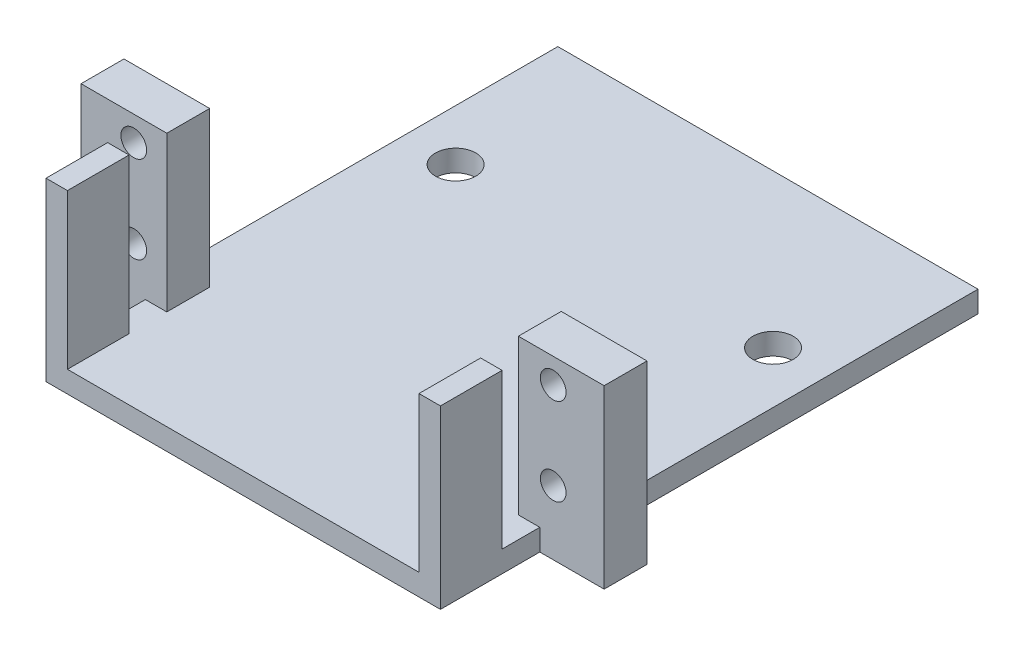
ISO-10303-21;
HEADER;
FILE_DESCRIPTION(('STEP AP214'),'2;1');
FILE_NAME('part.step','',(''),(''),'','','');
FILE_SCHEMA(('AUTOMOTIVE_DESIGN { 1 0 10303 214 1 1 1 1 }'));
ENDSEC;
DATA;
#1=APPLICATION_CONTEXT('core data for automotive mechanical design processes');
#2=APPLICATION_PROTOCOL_DEFINITION('international standard','automotive_design',2000,#1);
#3=PRODUCT_CONTEXT('',#1,'mechanical');
#4=PRODUCT('Part','Part','',(#3));
#5=PRODUCT_RELATED_PRODUCT_CATEGORY('part','',(#4));
#6=PRODUCT_DEFINITION_FORMATION('','',#4);
#7=PRODUCT_DEFINITION_CONTEXT('part definition',#1,'design');
#8=PRODUCT_DEFINITION('design','',#6,#7);
#9=PRODUCT_DEFINITION_SHAPE('','',#8);
#10=(LENGTH_UNIT() NAMED_UNIT(*) SI_UNIT(.MILLI.,.METRE.));
#11=(NAMED_UNIT(*) PLANE_ANGLE_UNIT() SI_UNIT($,.RADIAN.));
#12=(NAMED_UNIT(*) SI_UNIT($,.STERADIAN.) SOLID_ANGLE_UNIT());
#13=UNCERTAINTY_MEASURE_WITH_UNIT(LENGTH_MEASURE(1.E-05),#10,'distance_accuracy_value','');
#14=(GEOMETRIC_REPRESENTATION_CONTEXT(3) GLOBAL_UNCERTAINTY_ASSIGNED_CONTEXT((#13)) GLOBAL_UNIT_ASSIGNED_CONTEXT((#10,
#11,#12)) REPRESENTATION_CONTEXT('',''));
#15=CARTESIAN_POINT('',(0.,0.,0.));
#16=DIRECTION('',(0.,0.,1.));
#17=DIRECTION('',(1.,0.,0.));
#18=AXIS2_PLACEMENT_3D('',#15,#16,#17);
#19=CARTESIAN_POINT('',(0.,0.,-16.5879556901824));
#20=DIRECTION('',(0.,0.,-1.));
#21=DIRECTION('',(-1.,0.,0.));
#22=AXIS2_PLACEMENT_3D('',#19,#20,#21);
#23=PLANE('',#22);
#24=CARTESIAN_POINT('',(47.5606848099596,17.6577374882275,-16.5879556901824));
#25=DIRECTION('',(0.,0.,-1.));
#26=DIRECTION('',(-1.,0.,0.));
#27=AXIS2_PLACEMENT_3D('',#24,#25,#26);
#28=CIRCLE('',#27,1.5);
#29=CARTESIAN_POINT('',(46.0606848099596,17.6577374882275,-16.5879556901824));
#30=VERTEX_POINT('',#29);
#31=EDGE_CURVE('E203',#30,#30,#28,.T.);
#32=ORIENTED_EDGE('',*,*,#31,.F.);
#33=EDGE_LOOP('',(#32));
#34=FACE_BOUND('',#33,.T.);
#35=CARTESIAN_POINT('',(47.5606848099596,7.49231825723698,-16.5879556901824));
#36=DIRECTION('',(0.,0.,-1.));
#37=DIRECTION('',(-1.,0.,0.));
#38=AXIS2_PLACEMENT_3D('',#35,#36,#37);
#39=CIRCLE('',#38,1.5);
#40=CARTESIAN_POINT('',(46.0606848099596,7.49231825723698,-16.5879556901824));
#41=VERTEX_POINT('',#40);
#42=EDGE_CURVE('E238',#41,#41,#39,.T.);
#43=ORIENTED_EDGE('',*,*,#42,.F.);
#44=EDGE_LOOP('',(#43));
#45=FACE_BOUND('',#44,.T.);
#46=DIRECTION('',(0.,-1.,0.));
#47=VECTOR('',#46,1.);
#48=CARTESIAN_POINT('',(43.5,23.3351197596058,-16.5879556901824));
#49=LINE('',#48,#47);
#50=CARTESIAN_POINT('',(43.5,20.5528543990891,-16.5879556901824));
#51=VERTEX_POINT('',#50);
#52=CARTESIAN_POINT('',(43.5,2.5,-16.5879556901824));
#53=VERTEX_POINT('',#52);
#54=EDGE_CURVE('E299',#51,#53,#49,.T.);
#55=ORIENTED_EDGE('',*,*,#54,.F.);
#56=DIRECTION('',(-1.,0.,0.));
#57=VECTOR('',#56,1.);
#58=CARTESIAN_POINT('',(43.5,20.5528543990891,-16.5879556901824));
#59=LINE('',#58,#57);
#60=CARTESIAN_POINT('',(53.5,20.5528543990891,-16.5879556901824));
#61=VERTEX_POINT('',#60);
#62=EDGE_CURVE('E308',#61,#51,#59,.T.);
#63=ORIENTED_EDGE('',*,*,#62,.F.);
#64=DIRECTION('',(0.,1.,0.));
#65=VECTOR('',#64,1.);
#66=CARTESIAN_POINT('',(53.5,20.5528543990891,-16.5879556901824));
#67=LINE('',#66,#65);
#68=CARTESIAN_POINT('',(53.5,0.,-16.5879556901824));
#69=VERTEX_POINT('',#68);
#70=EDGE_CURVE('E313',#69,#61,#67,.T.);
#71=ORIENTED_EDGE('',*,*,#70,.F.);
#72=DIRECTION('',(1.,0.,0.));
#73=VECTOR('',#72,1.);
#74=CARTESIAN_POINT('',(2.5,0.,-16.5879556901824));
#75=LINE('',#74,#73);
#76=CARTESIAN_POINT('',(47.5,0.,-16.5879556901824));
#77=VERTEX_POINT('',#76);
#78=EDGE_CURVE('E331',#77,#69,#75,.T.);
#79=ORIENTED_EDGE('',*,*,#78,.F.);
#80=DIRECTION('',(0.,-1.,0.));
#81=VECTOR('',#80,1.);
#82=CARTESIAN_POINT('',(47.5,2.5,-16.5879556901824));
#83=LINE('',#82,#81);
#84=CARTESIAN_POINT('',(47.5,2.5,-16.5879556901824));
#85=VERTEX_POINT('',#84);
#86=EDGE_CURVE('E231',#85,#77,#83,.T.);
#87=ORIENTED_EDGE('',*,*,#86,.F.);
#88=DIRECTION('',(1.,0.,0.));
#89=VECTOR('',#88,1.);
#90=CARTESIAN_POINT('',(47.5,2.5,-16.5879556901824));
#91=LINE('',#90,#89);
#92=EDGE_CURVE('E11',#53,#85,#91,.T.);
#93=ORIENTED_EDGE('',*,*,#92,.F.);
#94=EDGE_LOOP('',(#55,#63,#71,#79,#87,#93));
#95=FACE_BOUND('',#94,.T.);
#96=ADVANCED_FACE('F45',(#34,#45,#95),#23,.T.);
#97=CARTESIAN_POINT('',(0.,2.5,0.));
#98=DIRECTION('',(1.,0.,0.));
#99=DIRECTION('',(0.,0.,-1.));
#100=AXIS2_PLACEMENT_3D('',#97,#98,#99);
#101=PLANE('',#100);
#102=DIRECTION('',(0.,-1.,0.));
#103=VECTOR('',#102,1.);
#104=CARTESIAN_POINT('',(0.,2.5,0.));
#105=LINE('',#104,#103);
#106=CARTESIAN_POINT('',(0.,20.5528543990891,0.));
#107=VERTEX_POINT('',#106);
#108=CARTESIAN_POINT('',(0.,0.,0.));
#109=VERTEX_POINT('',#108);
#110=EDGE_CURVE('E54',#107,#109,#105,.T.);
#111=ORIENTED_EDGE('',*,*,#110,.F.);
#112=DIRECTION('',(0.,0.,1.));
#113=VECTOR('',#112,1.);
#114=CARTESIAN_POINT('',(0.,20.5528543990891,0.));
#115=LINE('',#114,#113);
#116=CARTESIAN_POINT('',(0.,20.5528543990891,-7.18795569018244));
#117=VERTEX_POINT('',#116);
#118=EDGE_CURVE('E195',#117,#107,#115,.T.);
#119=ORIENTED_EDGE('',*,*,#118,.F.);
#120=DIRECTION('',(0.,-1.,0.));
#121=VECTOR('',#120,1.);
#122=CARTESIAN_POINT('',(0.,23.3351197596058,-7.18795569018244));
#123=LINE('',#122,#121);
#124=CARTESIAN_POINT('',(0.,2.5,-7.18795569018244));
#125=VERTEX_POINT('',#124);
#126=EDGE_CURVE('E369',#117,#125,#123,.T.);
#127=ORIENTED_EDGE('',*,*,#126,.T.);
#128=DIRECTION('',(0.,0.,1.));
#129=VECTOR('',#128,1.);
#130=CARTESIAN_POINT('',(0.,2.5,0.));
#131=LINE('',#130,#129);
#132=CARTESIAN_POINT('',(0.,2.5,-11.5879556901824));
#133=VERTEX_POINT('',#132);
#134=EDGE_CURVE('E385',#133,#125,#131,.T.);
#135=ORIENTED_EDGE('',*,*,#134,.F.);
#136=DIRECTION('',(0.,1.,0.));
#137=VECTOR('',#136,1.);
#138=CARTESIAN_POINT('',(0.,2.5,-11.5879556901824));
#139=LINE('',#138,#137);
#140=CARTESIAN_POINT('',(0.,0.,-11.5879556901824));
#141=VERTEX_POINT('',#140);
#142=EDGE_CURVE('E343',#141,#133,#139,.T.);
#143=ORIENTED_EDGE('',*,*,#142,.F.);
#144=DIRECTION('',(0.,0.,1.));
#145=VECTOR('',#144,1.);
#146=CARTESIAN_POINT('',(0.,0.,0.));
#147=LINE('',#146,#145);
#148=EDGE_CURVE('E217',#141,#109,#147,.T.);
#149=ORIENTED_EDGE('',*,*,#148,.T.);
#150=EDGE_LOOP('',(#111,#119,#127,#135,#143,#149));
#151=FACE_BOUND('',#150,.T.);
#152=ADVANCED_FACE('F47',(#151),#101,.F.);
#153=CARTESIAN_POINT('',(0.,2.5,0.));
#154=DIRECTION('',(0.,-1.,0.));
#155=DIRECTION('',(0.,0.,-1.));
#156=AXIS2_PLACEMENT_3D('',#153,#154,#155);
#157=PLANE('',#156);
#158=CARTESIAN_POINT('',(4.45821471843474,2.5,-43.3137770735381));
#159=DIRECTION('',(0.,1.,0.));
#160=DIRECTION('',(0.,0.,1.));
#161=AXIS2_PLACEMENT_3D('',#158,#159,#160);
#162=CIRCLE('',#161,2.35);
#163=CARTESIAN_POINT('',(4.45821471843474,2.5,-40.9637770735381));
#164=VERTEX_POINT('',#163);
#165=EDGE_CURVE('E229',#164,#164,#162,.T.);
#166=ORIENTED_EDGE('',*,*,#165,.F.);
#167=EDGE_LOOP('',(#166));
#168=FACE_BOUND('',#167,.T.);
#169=CARTESIAN_POINT('',(41.4727830719634,2.5,-43.3137770735381));
#170=DIRECTION('',(0.,1.,0.));
#171=DIRECTION('',(0.,0.,1.));
#172=AXIS2_PLACEMENT_3D('',#169,#170,#171);
#173=CIRCLE('',#172,2.35);
#174=CARTESIAN_POINT('',(41.4727830719634,2.5,-40.9637770735381));
#175=VERTEX_POINT('',#174);
#176=EDGE_CURVE('E267',#175,#175,#173,.T.);
#177=ORIENTED_EDGE('',*,*,#176,.F.);
#178=EDGE_LOOP('',(#177));
#179=FACE_BOUND('',#178,.T.);
#180=DIRECTION('',(0.,0.,1.));
#181=VECTOR('',#180,1.);
#182=CARTESIAN_POINT('',(43.5,2.5,-36.6140310455788));
#183=LINE('',#182,#181);
#184=CARTESIAN_POINT('',(43.5,2.5,-11.5879556901824));
#185=VERTEX_POINT('',#184);
#186=EDGE_CURVE('E351',#53,#185,#183,.T.);
#187=ORIENTED_EDGE('',*,*,#186,.F.);
#188=ORIENTED_EDGE('',*,*,#92,.T.);
#189=DIRECTION('',(0.,0.,1.));
#190=VECTOR('',#189,1.);
#191=CARTESIAN_POINT('',(47.5,2.5,-61.1897123757275));
#192=LINE('',#191,#190);
#193=CARTESIAN_POINT('',(47.5,2.5,-61.1897123757275));
#194=VERTEX_POINT('',#193);
#195=EDGE_CURVE('E281',#194,#85,#192,.T.);
#196=ORIENTED_EDGE('',*,*,#195,.F.);
#197=DIRECTION('',(1.,0.,0.));
#198=VECTOR('',#197,1.);
#199=CARTESIAN_POINT('',(47.5,2.5,-61.1897123757275));
#200=LINE('',#199,#198);
#201=CARTESIAN_POINT('',(-1.5,2.5,-61.1897123757275));
#202=VERTEX_POINT('',#201);
#203=EDGE_CURVE('E279',#202,#194,#200,.T.);
#204=ORIENTED_EDGE('',*,*,#203,.F.);
#205=DIRECTION('',(0.,0.,1.));
#206=VECTOR('',#205,1.);
#207=CARTESIAN_POINT('',(-1.5,2.5,-61.1897123757275));
#208=LINE('',#207,#206);
#209=CARTESIAN_POINT('',(-1.5,2.5,-16.5879556901824));
#210=VERTEX_POINT('',#209);
#211=EDGE_CURVE('E290',#202,#210,#208,.T.);
#212=ORIENTED_EDGE('',*,*,#211,.T.);
#213=CARTESIAN_POINT('',(2.5,2.5,-16.5879556901824));
#214=VERTEX_POINT('',#213);
#215=EDGE_CURVE('E56',#210,#214,#91,.T.);
#216=ORIENTED_EDGE('',*,*,#215,.T.);
#217=DIRECTION('',(0.,0.,-1.));
#218=VECTOR('',#217,1.);
#219=CARTESIAN_POINT('',(2.5,2.5,-36.6140310455788));
#220=LINE('',#219,#218);
#221=CARTESIAN_POINT('',(2.5,2.5,-11.5879556901824));
#222=VERTEX_POINT('',#221);
#223=EDGE_CURVE('E380',#222,#214,#220,.T.);
#224=ORIENTED_EDGE('',*,*,#223,.F.);
#225=DIRECTION('',(1.,0.,0.));
#226=VECTOR('',#225,1.);
#227=CARTESIAN_POINT('',(0.,2.5,-11.5879556901824));
#228=LINE('',#227,#226);
#229=EDGE_CURVE('E377',#133,#222,#228,.T.);
#230=ORIENTED_EDGE('',*,*,#229,.F.);
#231=ORIENTED_EDGE('',*,*,#134,.T.);
#232=DIRECTION('',(-1.,0.,0.));
#233=VECTOR('',#232,1.);
#234=CARTESIAN_POINT('',(0.,2.5,-7.18795569018244));
#235=LINE('',#234,#233);
#236=CARTESIAN_POINT('',(2.5,2.5,-7.18795569018244));
#237=VERTEX_POINT('',#236);
#238=EDGE_CURVE('E371',#237,#125,#235,.T.);
#239=ORIENTED_EDGE('',*,*,#238,.F.);
#240=DIRECTION('',(0.,0.,-1.));
#241=VECTOR('',#240,1.);
#242=CARTESIAN_POINT('',(2.5,2.5,0.));
#243=LINE('',#242,#241);
#244=CARTESIAN_POINT('',(2.5,2.5,0.));
#245=VERTEX_POINT('',#244);
#246=EDGE_CURVE('E374',#245,#237,#243,.T.);
#247=ORIENTED_EDGE('',*,*,#246,.F.);
#248=DIRECTION('',(1.,0.,0.));
#249=VECTOR('',#248,1.);
#250=CARTESIAN_POINT('',(0.,2.5,0.));
#251=LINE('',#250,#249);
#252=CARTESIAN_POINT('',(43.5,2.5,0.));
#253=VERTEX_POINT('',#252);
#254=EDGE_CURVE('E388',#245,#253,#251,.T.);
#255=ORIENTED_EDGE('',*,*,#254,.T.);
#256=DIRECTION('',(0.,0.,1.));
#257=VECTOR('',#256,1.);
#258=CARTESIAN_POINT('',(43.5,2.5,0.));
#259=LINE('',#258,#257);
#260=CARTESIAN_POINT('',(43.5,2.5,-7.18795569018244));
#261=VERTEX_POINT('',#260);
#262=EDGE_CURVE('E360',#261,#253,#259,.T.);
#263=ORIENTED_EDGE('',*,*,#262,.F.);
#264=DIRECTION('',(-1.,0.,0.));
#265=VECTOR('',#264,1.);
#266=CARTESIAN_POINT('',(46.,2.5,-7.18795569018244));
#267=LINE('',#266,#265);
#268=CARTESIAN_POINT('',(46.,2.5,-7.18795569018244));
#269=VERTEX_POINT('',#268);
#270=EDGE_CURVE('E363',#269,#261,#267,.T.);
#271=ORIENTED_EDGE('',*,*,#270,.F.);
#272=DIRECTION('',(0.,0.,-1.));
#273=VECTOR('',#272,1.);
#274=CARTESIAN_POINT('',(46.,2.5,0.));
#275=LINE('',#274,#273);
#276=CARTESIAN_POINT('',(46.,2.5,-11.5879556901824));
#277=VERTEX_POINT('',#276);
#278=EDGE_CURVE('E221',#269,#277,#275,.T.);
#279=ORIENTED_EDGE('',*,*,#278,.T.);
#280=DIRECTION('',(1.,0.,0.));
#281=VECTOR('',#280,1.);
#282=CARTESIAN_POINT('',(46.,2.5,-11.5879556901824));
#283=LINE('',#282,#281);
#284=EDGE_CURVE('E349',#185,#277,#283,.T.);
#285=ORIENTED_EDGE('',*,*,#284,.F.);
#286=EDGE_LOOP('',(#187,#188,#196,#204,#212,#216,#224,#230,#231,#239,#247,#255,#263,#271,#279,#285));
#287=FACE_BOUND('',#286,.T.);
#288=ADVANCED_FACE('F425',(#168,#179,#287),#157,.F.);
#289=CARTESIAN_POINT('',(0.,2.5,0.));
#290=DIRECTION('',(0.,0.,-1.));
#291=DIRECTION('',(-1.,0.,0.));
#292=AXIS2_PLACEMENT_3D('',#289,#290,#291);
#293=PLANE('',#292);
#294=DIRECTION('',(0.,-1.,0.));
#295=VECTOR('',#294,1.);
#296=CARTESIAN_POINT('',(46.,2.5,0.));
#297=LINE('',#296,#295);
#298=CARTESIAN_POINT('',(46.,20.5528543990891,0.));
#299=VERTEX_POINT('',#298);
#300=CARTESIAN_POINT('',(46.,0.,0.));
#301=VERTEX_POINT('',#300);
#302=EDGE_CURVE('E219',#299,#301,#297,.T.);
#303=ORIENTED_EDGE('',*,*,#302,.F.);
#304=DIRECTION('',(-1.,0.,0.));
#305=VECTOR('',#304,1.);
#306=CARTESIAN_POINT('',(47.,20.5528543990891,0.));
#307=LINE('',#306,#305);
#308=CARTESIAN_POINT('',(43.5,20.5528543990891,0.));
#309=VERTEX_POINT('',#308);
#310=EDGE_CURVE('E213',#299,#309,#307,.T.);
#311=ORIENTED_EDGE('',*,*,#310,.T.);
#312=DIRECTION('',(0.,-1.,0.));
#313=VECTOR('',#312,1.);
#314=CARTESIAN_POINT('',(43.5,23.3351197596058,0.));
#315=LINE('',#314,#313);
#316=EDGE_CURVE('E358',#309,#253,#315,.T.);
#317=ORIENTED_EDGE('',*,*,#316,.T.);
#318=ORIENTED_EDGE('',*,*,#254,.F.);
#319=DIRECTION('',(0.,-1.,0.));
#320=VECTOR('',#319,1.);
#321=CARTESIAN_POINT('',(2.5,23.3351197596058,0.));
#322=LINE('',#321,#320);
#323=CARTESIAN_POINT('',(2.5,20.5528543990891,0.));
#324=VERTEX_POINT('',#323);
#325=EDGE_CURVE('E212',#324,#245,#322,.T.);
#326=ORIENTED_EDGE('',*,*,#325,.F.);
#327=EDGE_CURVE('E198',#324,#107,#307,.T.);
#328=ORIENTED_EDGE('',*,*,#327,.T.);
#329=ORIENTED_EDGE('',*,*,#110,.T.);
#330=DIRECTION('',(1.,0.,0.));
#331=VECTOR('',#330,1.);
#332=CARTESIAN_POINT('',(0.,0.,0.));
#333=LINE('',#332,#331);
#334=EDGE_CURVE('E395',#109,#301,#333,.T.);
#335=ORIENTED_EDGE('',*,*,#334,.T.);
#336=EDGE_LOOP('',(#303,#311,#317,#318,#326,#328,#329,#335));
#337=FACE_BOUND('',#336,.T.);
#338=ADVANCED_FACE('F208',(#337),#293,.F.);
#339=CARTESIAN_POINT('',(46.,2.5,0.));
#340=DIRECTION('',(-1.,0.,0.));
#341=DIRECTION('',(0.,0.,1.));
#342=AXIS2_PLACEMENT_3D('',#339,#340,#341);
#343=PLANE('',#342);
#344=DIRECTION('',(0.,-1.,0.));
#345=VECTOR('',#344,1.);
#346=CARTESIAN_POINT('',(46.,23.3351197596058,-7.18795569018244));
#347=LINE('',#346,#345);
#348=CARTESIAN_POINT('',(46.,20.5528543990891,-7.18795569018244));
#349=VERTEX_POINT('',#348);
#350=EDGE_CURVE('E354',#349,#269,#347,.T.);
#351=ORIENTED_EDGE('',*,*,#350,.F.);
#352=DIRECTION('',(0.,0.,1.));
#353=VECTOR('',#352,1.);
#354=CARTESIAN_POINT('',(46.,20.5528543990891,0.));
#355=LINE('',#354,#353);
#356=EDGE_CURVE('E259',#349,#299,#355,.T.);
#357=ORIENTED_EDGE('',*,*,#356,.T.);
#358=ORIENTED_EDGE('',*,*,#302,.T.);
#359=DIRECTION('',(0.,0.,-1.));
#360=VECTOR('',#359,1.);
#361=CARTESIAN_POINT('',(46.,0.,0.));
#362=LINE('',#361,#360);
#363=CARTESIAN_POINT('',(46.,0.,-11.5879556901824));
#364=VERTEX_POINT('',#363);
#365=EDGE_CURVE('E389',#301,#364,#362,.T.);
#366=ORIENTED_EDGE('',*,*,#365,.T.);
#367=DIRECTION('',(0.,1.,0.));
#368=VECTOR('',#367,1.);
#369=CARTESIAN_POINT('',(46.,2.5,-11.5879556901824));
#370=LINE('',#369,#368);
#371=EDGE_CURVE('E318',#364,#277,#370,.T.);
#372=ORIENTED_EDGE('',*,*,#371,.T.);
#373=ORIENTED_EDGE('',*,*,#278,.F.);
#374=EDGE_LOOP('',(#351,#357,#358,#366,#372,#373));
#375=FACE_BOUND('',#374,.T.);
#376=ADVANCED_FACE('F400',(#375),#343,.F.);
#377=CARTESIAN_POINT('',(0.,0.,0.));
#378=DIRECTION('',(0.,-1.,0.));
#379=DIRECTION('',(0.,0.,-1.));
#380=AXIS2_PLACEMENT_3D('',#377,#378,#379);
#381=PLANE('',#380);
#382=CARTESIAN_POINT('',(4.45821471843474,0.,-43.3137770735381));
#383=DIRECTION('',(0.,-1.,0.));
#384=DIRECTION('',(0.,0.,-1.));
#385=AXIS2_PLACEMENT_3D('',#382,#383,#384);
#386=CIRCLE('',#385,2.35);
#387=CARTESIAN_POINT('',(4.45821471843474,0.,-45.6637770735381));
#388=VERTEX_POINT('',#387);
#389=EDGE_CURVE('E228',#388,#388,#386,.T.);
#390=ORIENTED_EDGE('',*,*,#389,.F.);
#391=EDGE_LOOP('',(#390));
#392=FACE_BOUND('',#391,.T.);
#393=CARTESIAN_POINT('',(41.4727830719634,0.,-43.3137770735381));
#394=DIRECTION('',(0.,-1.,0.));
#395=DIRECTION('',(0.,0.,-1.));
#396=AXIS2_PLACEMENT_3D('',#393,#394,#395);
#397=CIRCLE('',#396,2.35);
#398=CARTESIAN_POINT('',(41.4727830719634,0.,-45.6637770735381));
#399=VERTEX_POINT('',#398);
#400=EDGE_CURVE('E225',#399,#399,#397,.T.);
#401=ORIENTED_EDGE('',*,*,#400,.F.);
#402=EDGE_LOOP('',(#401));
#403=FACE_BOUND('',#402,.T.);
#404=CARTESIAN_POINT('',(-7.5,0.,-16.5879556901824));
#405=VERTEX_POINT('',#404);
#406=CARTESIAN_POINT('',(-1.5,0.,-16.5879556901824));
#407=VERTEX_POINT('',#406);
#408=EDGE_CURVE('E332',#405,#407,#75,.T.);
#409=ORIENTED_EDGE('',*,*,#408,.T.);
#410=DIRECTION('',(0.,0.,1.));
#411=VECTOR('',#410,1.);
#412=CARTESIAN_POINT('',(-1.5,0.,-61.1897123757275));
#413=LINE('',#412,#411);
#414=CARTESIAN_POINT('',(-1.5,0.,-61.1897123757275));
#415=VERTEX_POINT('',#414);
#416=EDGE_CURVE('E293',#415,#407,#413,.T.);
#417=ORIENTED_EDGE('',*,*,#416,.F.);
#418=DIRECTION('',(-1.,0.,0.));
#419=VECTOR('',#418,1.);
#420=CARTESIAN_POINT('',(47.5,0.,-61.1897123757275));
#421=LINE('',#420,#419);
#422=CARTESIAN_POINT('',(47.5,0.,-61.1897123757275));
#423=VERTEX_POINT('',#422);
#424=EDGE_CURVE('E275',#423,#415,#421,.T.);
#425=ORIENTED_EDGE('',*,*,#424,.F.);
#426=DIRECTION('',(0.,0.,1.));
#427=VECTOR('',#426,1.);
#428=CARTESIAN_POINT('',(47.5,0.,-61.1897123757275));
#429=LINE('',#428,#427);
#430=EDGE_CURVE('E296',#423,#77,#429,.T.);
#431=ORIENTED_EDGE('',*,*,#430,.T.);
#432=ORIENTED_EDGE('',*,*,#78,.T.);
#433=DIRECTION('',(0.,0.,1.));
#434=VECTOR('',#433,1.);
#435=CARTESIAN_POINT('',(53.5,0.,-16.5879556901824));
#436=LINE('',#435,#434);
#437=CARTESIAN_POINT('',(53.5,0.,-11.5879556901824));
#438=VERTEX_POINT('',#437);
#439=EDGE_CURVE('E305',#69,#438,#436,.T.);
#440=ORIENTED_EDGE('',*,*,#439,.T.);
#441=DIRECTION('',(1.,0.,0.));
#442=VECTOR('',#441,1.);
#443=CARTESIAN_POINT('',(43.5,0.,-11.5879556901824));
#444=LINE('',#443,#442);
#445=EDGE_CURVE('E316',#364,#438,#444,.T.);
#446=ORIENTED_EDGE('',*,*,#445,.F.);
#447=ORIENTED_EDGE('',*,*,#365,.F.);
#448=ORIENTED_EDGE('',*,*,#334,.F.);
#449=ORIENTED_EDGE('',*,*,#148,.F.);
#450=DIRECTION('',(1.,0.,0.));
#451=VECTOR('',#450,1.);
#452=CARTESIAN_POINT('',(2.5,0.,-11.5879556901824));
#453=LINE('',#452,#451);
#454=CARTESIAN_POINT('',(-7.5,0.,-11.5879556901824));
#455=VERTEX_POINT('',#454);
#456=EDGE_CURVE('E328',#455,#141,#453,.T.);
#457=ORIENTED_EDGE('',*,*,#456,.F.);
#458=DIRECTION('',(0.,0.,1.));
#459=VECTOR('',#458,1.);
#460=CARTESIAN_POINT('',(-7.5,0.,-16.5879556901824));
#461=LINE('',#460,#459);
#462=EDGE_CURVE('E341',#405,#455,#461,.T.);
#463=ORIENTED_EDGE('',*,*,#462,.F.);
#464=EDGE_LOOP('',(#409,#417,#425,#431,#432,#440,#446,#447,#448,#449,#457,#463));
#465=FACE_BOUND('',#464,.T.);
#466=ADVANCED_FACE('F407',(#392,#403,#465),#381,.T.);
#467=CARTESIAN_POINT('',(0.,23.3351197596058,-11.5879556901824));
#468=DIRECTION('',(0.,0.,-1.));
#469=DIRECTION('',(-1.,0.,0.));
#470=AXIS2_PLACEMENT_3D('',#467,#468,#469);
#471=PLANE('',#470);
#472=CARTESIAN_POINT('',(-1.35350086844493,7.49231825723698,-11.5879556901824));
#473=DIRECTION('',(0.,0.,1.));
#474=DIRECTION('',(1.,0.,0.));
#475=AXIS2_PLACEMENT_3D('',#472,#473,#474);
#476=CIRCLE('',#475,1.5);
#477=CARTESIAN_POINT('',(0.146499131555073,7.49231825723698,-11.5879556901824));
#478=VERTEX_POINT('',#477);
#479=EDGE_CURVE('E240',#478,#478,#476,.T.);
#480=ORIENTED_EDGE('',*,*,#479,.F.);
#481=EDGE_LOOP('',(#480));
#482=FACE_BOUND('',#481,.T.);
#483=CARTESIAN_POINT('',(-1.35350086844493,17.6577374882275,-11.5879556901824));
#484=DIRECTION('',(0.,0.,1.));
#485=DIRECTION('',(1.,0.,0.));
#486=AXIS2_PLACEMENT_3D('',#483,#484,#485);
#487=CIRCLE('',#486,1.5);
#488=CARTESIAN_POINT('',(0.146499131555073,17.6577374882275,-11.5879556901824));
#489=VERTEX_POINT('',#488);
#490=EDGE_CURVE('E234',#489,#489,#487,.T.);
#491=ORIENTED_EDGE('',*,*,#490,.F.);
#492=EDGE_LOOP('',(#491));
#493=FACE_BOUND('',#492,.T.);
#494=DIRECTION('',(0.,-1.,0.));
#495=VECTOR('',#494,1.);
#496=CARTESIAN_POINT('',(2.5,23.3351197596058,-11.5879556901824));
#497=LINE('',#496,#495);
#498=CARTESIAN_POINT('',(2.5,20.5528543990891,-11.5879556901824));
#499=VERTEX_POINT('',#498);
#500=EDGE_CURVE('E383',#499,#222,#497,.T.);
#501=ORIENTED_EDGE('',*,*,#500,.F.);
#502=DIRECTION('',(-1.,0.,0.));
#503=VECTOR('',#502,1.);
#504=CARTESIAN_POINT('',(2.5,20.5528543990891,-11.5879556901824));
#505=LINE('',#504,#503);
#506=CARTESIAN_POINT('',(-7.5,20.5528543990891,-11.5879556901824));
#507=VERTEX_POINT('',#506);
#508=EDGE_CURVE('E324',#499,#507,#505,.T.);
#509=ORIENTED_EDGE('',*,*,#508,.T.);
#510=DIRECTION('',(0.,-1.,0.));
#511=VECTOR('',#510,1.);
#512=CARTESIAN_POINT('',(-7.5,20.5528543990891,-11.5879556901824));
#513=LINE('',#512,#511);
#514=EDGE_CURVE('E337',#507,#455,#513,.T.);
#515=ORIENTED_EDGE('',*,*,#514,.T.);
#516=ORIENTED_EDGE('',*,*,#456,.T.);
#517=ORIENTED_EDGE('',*,*,#142,.T.);
#518=ORIENTED_EDGE('',*,*,#229,.T.);
#519=EDGE_LOOP('',(#501,#509,#515,#516,#517,#518));
#520=FACE_BOUND('',#519,.T.);
#521=ADVANCED_FACE('F497',(#482,#493,#520),#471,.F.);
#522=CARTESIAN_POINT('',(2.5,23.3351197596058,-36.6140310455788));
#523=DIRECTION('',(-1.,0.,0.));
#524=DIRECTION('',(0.,0.,1.));
#525=AXIS2_PLACEMENT_3D('',#522,#523,#524);
#526=PLANE('',#525);
#527=DIRECTION('',(0.,1.,0.));
#528=VECTOR('',#527,1.);
#529=CARTESIAN_POINT('',(2.5,23.3351197596058,-16.5879556901824));
#530=LINE('',#529,#528);
#531=CARTESIAN_POINT('',(2.5,20.5528543990891,-16.5879556901824));
#532=VERTEX_POINT('',#531);
#533=EDGE_CURVE('E301',#214,#532,#530,.T.);
#534=ORIENTED_EDGE('',*,*,#533,.T.);
#535=DIRECTION('',(0.,0.,1.));
#536=VECTOR('',#535,1.);
#537=CARTESIAN_POINT('',(2.5,20.5528543990891,-36.6140310455788));
#538=LINE('',#537,#536);
#539=EDGE_CURVE('E264',#532,#499,#538,.T.);
#540=ORIENTED_EDGE('',*,*,#539,.T.);
#541=ORIENTED_EDGE('',*,*,#500,.T.);
#542=ORIENTED_EDGE('',*,*,#223,.T.);
#543=EDGE_LOOP('',(#534,#540,#541,#542));
#544=FACE_BOUND('',#543,.T.);
#545=ADVANCED_FACE('F485',(#544),#526,.F.);
#546=CARTESIAN_POINT('',(2.5,23.3351197596058,0.));
#547=DIRECTION('',(-1.,0.,0.));
#548=DIRECTION('',(0.,0.,1.));
#549=AXIS2_PLACEMENT_3D('',#546,#547,#548);
#550=PLANE('',#549);
#551=DIRECTION('',(0.,-1.,0.));
#552=VECTOR('',#551,1.);
#553=CARTESIAN_POINT('',(2.5,23.3351197596058,-7.18795569018244));
#554=LINE('',#553,#552);
#555=CARTESIAN_POINT('',(2.5,20.5528543990891,-7.18795569018244));
#556=VERTEX_POINT('',#555);
#557=EDGE_CURVE('E367',#556,#237,#554,.T.);
#558=ORIENTED_EDGE('',*,*,#557,.F.);
#559=DIRECTION('',(0.,0.,1.));
#560=VECTOR('',#559,1.);
#561=CARTESIAN_POINT('',(2.5,20.5528543990891,0.));
#562=LINE('',#561,#560);
#563=EDGE_CURVE('E63',#556,#324,#562,.T.);
#564=ORIENTED_EDGE('',*,*,#563,.T.);
#565=ORIENTED_EDGE('',*,*,#325,.T.);
#566=ORIENTED_EDGE('',*,*,#246,.T.);
#567=EDGE_LOOP('',(#558,#564,#565,#566));
#568=FACE_BOUND('',#567,.T.);
#569=ADVANCED_FACE('F503',(#568),#550,.F.);
#570=CARTESIAN_POINT('',(0.,23.3351197596058,-7.18795569018244));
#571=DIRECTION('',(0.,0.,1.));
#572=DIRECTION('',(1.,0.,0.));
#573=AXIS2_PLACEMENT_3D('',#570,#571,#572);
#574=PLANE('',#573);
#575=ORIENTED_EDGE('',*,*,#126,.F.);
#576=DIRECTION('',(1.,0.,0.));
#577=VECTOR('',#576,1.);
#578=CARTESIAN_POINT('',(0.,20.5528543990891,-7.18795569018244));
#579=LINE('',#578,#577);
#580=EDGE_CURVE('E199',#117,#556,#579,.T.);
#581=ORIENTED_EDGE('',*,*,#580,.T.);
#582=ORIENTED_EDGE('',*,*,#557,.T.);
#583=ORIENTED_EDGE('',*,*,#238,.T.);
#584=EDGE_LOOP('',(#575,#581,#582,#583));
#585=FACE_BOUND('',#584,.T.);
#586=ADVANCED_FACE('F500',(#585),#574,.F.);
#587=CARTESIAN_POINT('',(46.,23.3351197596058,-7.18795569018244));
#588=DIRECTION('',(0.,0.,1.));
#589=DIRECTION('',(1.,0.,0.));
#590=AXIS2_PLACEMENT_3D('',#587,#588,#589);
#591=PLANE('',#590);
#592=DIRECTION('',(0.,-1.,0.));
#593=VECTOR('',#592,1.);
#594=CARTESIAN_POINT('',(43.5,23.3351197596058,-7.18795569018244));
#595=LINE('',#594,#593);
#596=CARTESIAN_POINT('',(43.5,20.5528543990891,-7.18795569018244));
#597=VERTEX_POINT('',#596);
#598=EDGE_CURVE('E356',#597,#261,#595,.T.);
#599=ORIENTED_EDGE('',*,*,#598,.F.);
#600=DIRECTION('',(1.,0.,0.));
#601=VECTOR('',#600,1.);
#602=CARTESIAN_POINT('',(46.,20.5528543990891,-7.18795569018244));
#603=LINE('',#602,#601);
#604=EDGE_CURVE('E71',#597,#349,#603,.T.);
#605=ORIENTED_EDGE('',*,*,#604,.T.);
#606=ORIENTED_EDGE('',*,*,#350,.T.);
#607=ORIENTED_EDGE('',*,*,#270,.T.);
#608=EDGE_LOOP('',(#599,#605,#606,#607));
#609=FACE_BOUND('',#608,.T.);
#610=ADVANCED_FACE('F430',(#609),#591,.F.);
#611=CARTESIAN_POINT('',(43.5,23.3351197596058,0.));
#612=DIRECTION('',(1.,0.,0.));
#613=DIRECTION('',(0.,0.,-1.));
#614=AXIS2_PLACEMENT_3D('',#611,#612,#613);
#615=PLANE('',#614);
#616=ORIENTED_EDGE('',*,*,#316,.F.);
#617=DIRECTION('',(0.,0.,-1.));
#618=VECTOR('',#617,1.);
#619=CARTESIAN_POINT('',(43.5,20.5528543990891,0.));
#620=LINE('',#619,#618);
#621=EDGE_CURVE('E256',#309,#597,#620,.T.);
#622=ORIENTED_EDGE('',*,*,#621,.T.);
#623=ORIENTED_EDGE('',*,*,#598,.T.);
#624=ORIENTED_EDGE('',*,*,#262,.T.);
#625=EDGE_LOOP('',(#616,#622,#623,#624));
#626=FACE_BOUND('',#625,.T.);
#627=ADVANCED_FACE('F433',(#626),#615,.F.);
#628=CARTESIAN_POINT('',(43.5,23.3351197596058,-36.6140310455788));
#629=DIRECTION('',(1.,0.,0.));
#630=DIRECTION('',(0.,0.,-1.));
#631=AXIS2_PLACEMENT_3D('',#628,#629,#630);
#632=PLANE('',#631);
#633=DIRECTION('',(0.,-1.,0.));
#634=VECTOR('',#633,1.);
#635=CARTESIAN_POINT('',(43.5,23.3351197596058,-11.5879556901824));
#636=LINE('',#635,#634);
#637=CARTESIAN_POINT('',(43.5,20.5528543990891,-11.5879556901824));
#638=VERTEX_POINT('',#637);
#639=EDGE_CURVE('E347',#638,#185,#636,.T.);
#640=ORIENTED_EDGE('',*,*,#639,.F.);
#641=DIRECTION('',(0.,0.,-1.));
#642=VECTOR('',#641,1.);
#643=CARTESIAN_POINT('',(43.5,20.5528543990891,-36.6140310455788));
#644=LINE('',#643,#642);
#645=EDGE_CURVE('E253',#638,#51,#644,.T.);
#646=ORIENTED_EDGE('',*,*,#645,.T.);
#647=ORIENTED_EDGE('',*,*,#54,.T.);
#648=ORIENTED_EDGE('',*,*,#186,.T.);
#649=EDGE_LOOP('',(#640,#646,#647,#648));
#650=FACE_BOUND('',#649,.T.);
#651=ADVANCED_FACE('F421',(#650),#632,.F.);
#652=CARTESIAN_POINT('',(46.,23.3351197596058,-11.5879556901824));
#653=DIRECTION('',(0.,0.,-1.));
#654=DIRECTION('',(-1.,0.,0.));
#655=AXIS2_PLACEMENT_3D('',#652,#653,#654);
#656=PLANE('',#655);
#657=CARTESIAN_POINT('',(47.5606848099596,17.6577374882275,-11.5879556901824));
#658=DIRECTION('',(0.,0.,1.));
#659=DIRECTION('',(1.,0.,0.));
#660=AXIS2_PLACEMENT_3D('',#657,#658,#659);
#661=CIRCLE('',#660,1.5);
#662=CARTESIAN_POINT('',(49.0606848099596,17.6577374882275,-11.5879556901824));
#663=VERTEX_POINT('',#662);
#664=EDGE_CURVE('E245',#663,#663,#661,.T.);
#665=ORIENTED_EDGE('',*,*,#664,.F.);
#666=EDGE_LOOP('',(#665));
#667=FACE_BOUND('',#666,.T.);
#668=CARTESIAN_POINT('',(47.5606848099596,7.49231825723698,-11.5879556901824));
#669=DIRECTION('',(0.,0.,1.));
#670=DIRECTION('',(1.,0.,0.));
#671=AXIS2_PLACEMENT_3D('',#668,#669,#670);
#672=CIRCLE('',#671,1.5);
#673=CARTESIAN_POINT('',(49.0606848099596,7.49231825723698,-11.5879556901824));
#674=VERTEX_POINT('',#673);
#675=EDGE_CURVE('E736',#674,#674,#672,.T.);
#676=ORIENTED_EDGE('',*,*,#675,.F.);
#677=EDGE_LOOP('',(#676));
#678=FACE_BOUND('',#677,.T.);
#679=DIRECTION('',(-1.,0.,0.));
#680=VECTOR('',#679,1.);
#681=CARTESIAN_POINT('',(43.5,20.5528543990891,-11.5879556901824));
#682=LINE('',#681,#680);
#683=CARTESIAN_POINT('',(53.5,20.5528543990891,-11.5879556901824));
#684=VERTEX_POINT('',#683);
#685=EDGE_CURVE('E310',#684,#638,#682,.T.);
#686=ORIENTED_EDGE('',*,*,#685,.T.);
#687=ORIENTED_EDGE('',*,*,#639,.T.);
#688=ORIENTED_EDGE('',*,*,#284,.T.);
#689=ORIENTED_EDGE('',*,*,#371,.F.);
#690=ORIENTED_EDGE('',*,*,#445,.T.);
#691=DIRECTION('',(0.,1.,0.));
#692=VECTOR('',#691,1.);
#693=CARTESIAN_POINT('',(53.5,20.5528543990891,-11.5879556901824));
#694=LINE('',#693,#692);
#695=EDGE_CURVE('E312',#438,#684,#694,.T.);
#696=ORIENTED_EDGE('',*,*,#695,.T.);
#697=EDGE_LOOP('',(#686,#687,#688,#689,#690,#696));
#698=FACE_BOUND('',#697,.T.);
#699=ADVANCED_FACE('F405',(#667,#678,#698),#656,.F.);
#700=CARTESIAN_POINT('',(2.5,20.5528543990891,-16.5879556901824));
#701=DIRECTION('',(0.,1.,0.));
#702=DIRECTION('',(0.,0.,1.));
#703=AXIS2_PLACEMENT_3D('',#700,#701,#702);
#704=PLANE('',#703);
#705=ORIENTED_EDGE('',*,*,#508,.F.);
#706=ORIENTED_EDGE('',*,*,#539,.F.);
#707=DIRECTION('',(-1.,0.,0.));
#708=VECTOR('',#707,1.);
#709=CARTESIAN_POINT('',(2.5,20.5528543990891,-16.5879556901824));
#710=LINE('',#709,#708);
#711=CARTESIAN_POINT('',(-7.5,20.5528543990891,-16.5879556901824));
#712=VERTEX_POINT('',#711);
#713=EDGE_CURVE('E325',#532,#712,#710,.T.);
#714=ORIENTED_EDGE('',*,*,#713,.T.);
#715=DIRECTION('',(0.,0.,1.));
#716=VECTOR('',#715,1.);
#717=CARTESIAN_POINT('',(-7.5,20.5528543990891,-16.5879556901824));
#718=LINE('',#717,#716);
#719=EDGE_CURVE('E335',#712,#507,#718,.T.);
#720=ORIENTED_EDGE('',*,*,#719,.T.);
#721=EDGE_LOOP('',(#705,#706,#714,#720));
#722=FACE_BOUND('',#721,.T.);
#723=ADVANCED_FACE('F465',(#722),#704,.T.);
#724=CARTESIAN_POINT('',(-1.35350086844493,7.49231825723698,-16.5879556901824));
#725=DIRECTION('',(0.,0.,-1.));
#726=DIRECTION('',(-1.,0.,0.));
#727=AXIS2_PLACEMENT_3D('',#724,#725,#726);
#728=CIRCLE('',#727,1.5);
#729=CARTESIAN_POINT('',(-2.85350086844493,7.49231825723698,-16.5879556901824));
#730=VERTEX_POINT('',#729);
#731=EDGE_CURVE('E49',#730,#730,#728,.T.);
#732=ORIENTED_EDGE('',*,*,#731,.F.);
#733=EDGE_LOOP('',(#732));
#734=FACE_BOUND('',#733,.T.);
#735=CARTESIAN_POINT('',(-1.35350086844493,17.6577374882275,-16.5879556901824));
#736=DIRECTION('',(0.,0.,-1.));
#737=DIRECTION('',(-1.,0.,0.));
#738=AXIS2_PLACEMENT_3D('',#735,#736,#737);
#739=CIRCLE('',#738,1.5);
#740=CARTESIAN_POINT('',(-2.85350086844493,17.6577374882275,-16.5879556901824));
#741=VERTEX_POINT('',#740);
#742=EDGE_CURVE('E232',#741,#741,#739,.T.);
#743=ORIENTED_EDGE('',*,*,#742,.F.);
#744=EDGE_LOOP('',(#743));
#745=FACE_BOUND('',#744,.T.);
#746=ORIENTED_EDGE('',*,*,#713,.F.);
#747=ORIENTED_EDGE('',*,*,#533,.F.);
#748=ORIENTED_EDGE('',*,*,#215,.F.);
#749=DIRECTION('',(0.,1.,0.));
#750=VECTOR('',#749,1.);
#751=CARTESIAN_POINT('',(-1.5,2.5,-16.5879556901824));
#752=LINE('',#751,#750);
#753=EDGE_CURVE('E284',#407,#210,#752,.T.);
#754=ORIENTED_EDGE('',*,*,#753,.F.);
#755=ORIENTED_EDGE('',*,*,#408,.F.);
#756=DIRECTION('',(0.,-1.,0.));
#757=VECTOR('',#756,1.);
#758=CARTESIAN_POINT('',(-7.5,20.5528543990891,-16.5879556901824));
#759=LINE('',#758,#757);
#760=EDGE_CURVE('E327',#712,#405,#759,.T.);
#761=ORIENTED_EDGE('',*,*,#760,.F.);
#762=EDGE_LOOP('',(#746,#747,#748,#754,#755,#761));
#763=FACE_BOUND('',#762,.T.);
#764=ADVANCED_FACE('F454',(#734,#745,#763),#23,.T.);
#765=CARTESIAN_POINT('',(-7.5,20.5528543990891,-16.5879556901824));
#766=DIRECTION('',(-1.,0.,0.));
#767=DIRECTION('',(0.,-1.,0.));
#768=AXIS2_PLACEMENT_3D('',#765,#766,#767);
#769=PLANE('',#768);
#770=ORIENTED_EDGE('',*,*,#514,.F.);
#771=ORIENTED_EDGE('',*,*,#719,.F.);
#772=ORIENTED_EDGE('',*,*,#760,.T.);
#773=ORIENTED_EDGE('',*,*,#462,.T.);
#774=EDGE_LOOP('',(#770,#771,#772,#773));
#775=FACE_BOUND('',#774,.T.);
#776=ADVANCED_FACE('F464',(#775),#769,.T.);
#777=CARTESIAN_POINT('',(43.5,20.5528543990891,-16.5879556901824));
#778=DIRECTION('',(0.,1.,0.));
#779=DIRECTION('',(0.,0.,1.));
#780=AXIS2_PLACEMENT_3D('',#777,#778,#779);
#781=PLANE('',#780);
#782=ORIENTED_EDGE('',*,*,#62,.T.);
#783=ORIENTED_EDGE('',*,*,#645,.F.);
#784=ORIENTED_EDGE('',*,*,#685,.F.);
#785=DIRECTION('',(0.,0.,1.));
#786=VECTOR('',#785,1.);
#787=CARTESIAN_POINT('',(53.5,20.5528543990891,-16.5879556901824));
#788=LINE('',#787,#786);
#789=EDGE_CURVE('E304',#61,#684,#788,.T.);
#790=ORIENTED_EDGE('',*,*,#789,.F.);
#791=EDGE_LOOP('',(#782,#783,#784,#790));
#792=FACE_BOUND('',#791,.T.);
#793=ADVANCED_FACE('F416',(#792),#781,.T.);
#794=CARTESIAN_POINT('',(53.5,20.5528543990891,-16.5879556901824));
#795=DIRECTION('',(1.,0.,0.));
#796=DIRECTION('',(0.,0.,-1.));
#797=AXIS2_PLACEMENT_3D('',#794,#795,#796);
#798=PLANE('',#797);
#799=ORIENTED_EDGE('',*,*,#695,.F.);
#800=ORIENTED_EDGE('',*,*,#439,.F.);
#801=ORIENTED_EDGE('',*,*,#70,.T.);
#802=ORIENTED_EDGE('',*,*,#789,.T.);
#803=EDGE_LOOP('',(#799,#800,#801,#802));
#804=FACE_BOUND('',#803,.T.);
#805=ADVANCED_FACE('F412',(#804),#798,.T.);
#806=CARTESIAN_POINT('',(47.5,2.5,-61.1897123757275));
#807=DIRECTION('',(-1.,0.,0.));
#808=DIRECTION('',(0.,0.,1.));
#809=AXIS2_PLACEMENT_3D('',#806,#807,#808);
#810=PLANE('',#809);
#811=ORIENTED_EDGE('',*,*,#86,.T.);
#812=ORIENTED_EDGE('',*,*,#430,.F.);
#813=DIRECTION('',(0.,-1.,0.));
#814=VECTOR('',#813,1.);
#815=CARTESIAN_POINT('',(47.5,2.5,-61.1897123757275));
#816=LINE('',#815,#814);
#817=EDGE_CURVE('E272',#194,#423,#816,.T.);
#818=ORIENTED_EDGE('',*,*,#817,.F.);
#819=ORIENTED_EDGE('',*,*,#195,.T.);
#820=EDGE_LOOP('',(#811,#812,#818,#819));
#821=FACE_BOUND('',#820,.T.);
#822=ADVANCED_FACE('F628',(#821),#810,.F.);
#823=CARTESIAN_POINT('',(-1.5,2.5,-61.1897123757275));
#824=DIRECTION('',(1.,0.,0.));
#825=DIRECTION('',(0.,1.,0.));
#826=AXIS2_PLACEMENT_3D('',#823,#824,#825);
#827=PLANE('',#826);
#828=ORIENTED_EDGE('',*,*,#753,.T.);
#829=ORIENTED_EDGE('',*,*,#211,.F.);
#830=DIRECTION('',(0.,1.,0.));
#831=VECTOR('',#830,1.);
#832=CARTESIAN_POINT('',(-1.5,2.5,-61.1897123757275));
#833=LINE('',#832,#831);
#834=EDGE_CURVE('E277',#415,#202,#833,.T.);
#835=ORIENTED_EDGE('',*,*,#834,.F.);
#836=ORIENTED_EDGE('',*,*,#416,.T.);
#837=EDGE_LOOP('',(#828,#829,#835,#836));
#838=FACE_BOUND('',#837,.T.);
#839=ADVANCED_FACE('F491',(#838),#827,.F.);
#840=CARTESIAN_POINT('',(0.,0.,-61.1897123757275));
#841=DIRECTION('',(0.,0.,-1.));
#842=DIRECTION('',(-1.,0.,0.));
#843=AXIS2_PLACEMENT_3D('',#840,#841,#842);
#844=PLANE('',#843);
#845=ORIENTED_EDGE('',*,*,#817,.T.);
#846=ORIENTED_EDGE('',*,*,#424,.T.);
#847=ORIENTED_EDGE('',*,*,#834,.T.);
#848=ORIENTED_EDGE('',*,*,#203,.T.);
#849=EDGE_LOOP('',(#845,#846,#847,#848));
#850=FACE_BOUND('',#849,.T.);
#851=ADVANCED_FACE('F644',(#850),#844,.T.);
#852=CARTESIAN_POINT('',(41.4727830719634,-54.5,-43.3137770735381));
#853=DIRECTION('',(0.,1.,0.));
#854=DIRECTION('',(0.,0.,1.));
#855=AXIS2_PLACEMENT_3D('',#852,#853,#854);
#856=CYLINDRICAL_SURFACE('',#855,2.35);
#857=ORIENTED_EDGE('',*,*,#400,.T.);
#858=EDGE_LOOP('',(#857));
#859=FACE_BOUND('',#858,.T.);
#860=ORIENTED_EDGE('',*,*,#176,.T.);
#861=EDGE_LOOP('',(#860));
#862=FACE_BOUND('',#861,.T.);
#863=ADVANCED_FACE('F447',(#859,#862),#856,.F.);
#864=CARTESIAN_POINT('',(4.45821471843474,-54.5,-43.3137770735381));
#865=DIRECTION('',(0.,1.,0.));
#866=DIRECTION('',(0.,0.,1.));
#867=AXIS2_PLACEMENT_3D('',#864,#865,#866);
#868=CYLINDRICAL_SURFACE('',#867,2.35);
#869=ORIENTED_EDGE('',*,*,#389,.T.);
#870=EDGE_LOOP('',(#869));
#871=FACE_BOUND('',#870,.T.);
#872=ORIENTED_EDGE('',*,*,#165,.T.);
#873=EDGE_LOOP('',(#872));
#874=FACE_BOUND('',#873,.T.);
#875=ADVANCED_FACE('F439',(#871,#874),#868,.F.);
#876=CARTESIAN_POINT('',(47.,20.5528543990891,0.));
#877=DIRECTION('',(0.,-1.,0.));
#878=DIRECTION('',(0.,0.,-1.));
#879=AXIS2_PLACEMENT_3D('',#876,#877,#878);
#880=PLANE('',#879);
#881=ORIENTED_EDGE('',*,*,#604,.F.);
#882=ORIENTED_EDGE('',*,*,#621,.F.);
#883=ORIENTED_EDGE('',*,*,#310,.F.);
#884=ORIENTED_EDGE('',*,*,#356,.F.);
#885=EDGE_LOOP('',(#881,#882,#883,#884));
#886=FACE_BOUND('',#885,.T.);
#887=ADVANCED_FACE('F437',(#886),#880,.F.);
#888=ORIENTED_EDGE('',*,*,#580,.F.);
#889=ORIENTED_EDGE('',*,*,#118,.T.);
#890=ORIENTED_EDGE('',*,*,#327,.F.);
#891=ORIENTED_EDGE('',*,*,#563,.F.);
#892=EDGE_LOOP('',(#888,#889,#890,#891));
#893=FACE_BOUND('',#892,.T.);
#894=ADVANCED_FACE('F197',(#893),#880,.F.);
#895=CARTESIAN_POINT('',(-1.35350086844493,17.6577374882275,-21.5879556901824));
#896=DIRECTION('',(0.,0.,1.));
#897=DIRECTION('',(1.,0.,0.));
#898=AXIS2_PLACEMENT_3D('',#895,#896,#897);
#899=CYLINDRICAL_SURFACE('',#898,1.5);
#900=ORIENTED_EDGE('',*,*,#742,.T.);
#901=EDGE_LOOP('',(#900));
#902=FACE_BOUND('',#901,.T.);
#903=ORIENTED_EDGE('',*,*,#490,.T.);
#904=EDGE_LOOP('',(#903));
#905=FACE_BOUND('',#904,.T.);
#906=ADVANCED_FACE('F445',(#902,#905),#899,.F.);
#907=CARTESIAN_POINT('',(-1.35350086844493,7.49231825723698,-21.5879556901824));
#908=DIRECTION('',(0.,0.,1.));
#909=DIRECTION('',(1.,0.,0.));
#910=AXIS2_PLACEMENT_3D('',#907,#908,#909);
#911=CYLINDRICAL_SURFACE('',#910,1.5);
#912=ORIENTED_EDGE('',*,*,#731,.T.);
#913=EDGE_LOOP('',(#912));
#914=FACE_BOUND('',#913,.T.);
#915=ORIENTED_EDGE('',*,*,#479,.T.);
#916=EDGE_LOOP('',(#915));
#917=FACE_BOUND('',#916,.T.);
#918=ADVANCED_FACE('F702',(#914,#917),#911,.F.);
#919=CARTESIAN_POINT('',(47.5606848099596,7.49231825723698,-21.5879556901824));
#920=DIRECTION('',(0.,0.,1.));
#921=DIRECTION('',(1.,0.,0.));
#922=AXIS2_PLACEMENT_3D('',#919,#920,#921);
#923=CYLINDRICAL_SURFACE('',#922,1.5);
#924=ORIENTED_EDGE('',*,*,#42,.T.);
#925=EDGE_LOOP('',(#924));
#926=FACE_BOUND('',#925,.T.);
#927=ORIENTED_EDGE('',*,*,#675,.T.);
#928=EDGE_LOOP('',(#927));
#929=FACE_BOUND('',#928,.T.);
#930=ADVANCED_FACE('F710',(#926,#929),#923,.F.);
#931=CARTESIAN_POINT('',(47.5606848099596,17.6577374882275,-21.5879556901824));
#932=DIRECTION('',(0.,0.,1.));
#933=DIRECTION('',(1.,0.,0.));
#934=AXIS2_PLACEMENT_3D('',#931,#932,#933);
#935=CYLINDRICAL_SURFACE('',#934,1.5);
#936=ORIENTED_EDGE('',*,*,#31,.T.);
#937=EDGE_LOOP('',(#936));
#938=FACE_BOUND('',#937,.T.);
#939=ORIENTED_EDGE('',*,*,#664,.T.);
#940=EDGE_LOOP('',(#939));
#941=FACE_BOUND('',#940,.T.);
#942=ADVANCED_FACE('F720',(#938,#941),#935,.F.);
#943=CLOSED_SHELL('',(#96,#152,#288,#338,#376,#466,#521,#545,#569,#586,#610,#627,#651,#699,#723,
#764,#776,#793,#805,#822,#839,#851,#863,#875,#887,#894,#906,#918,#930,#942));
#944=MANIFOLD_SOLID_BREP('B2',#943);
#945=ADVANCED_BREP_SHAPE_REPRESENTATION('',(#18,#944),#14);
#946=SHAPE_DEFINITION_REPRESENTATION(#9,#945);
ENDSEC;
END-ISO-10303-21;
